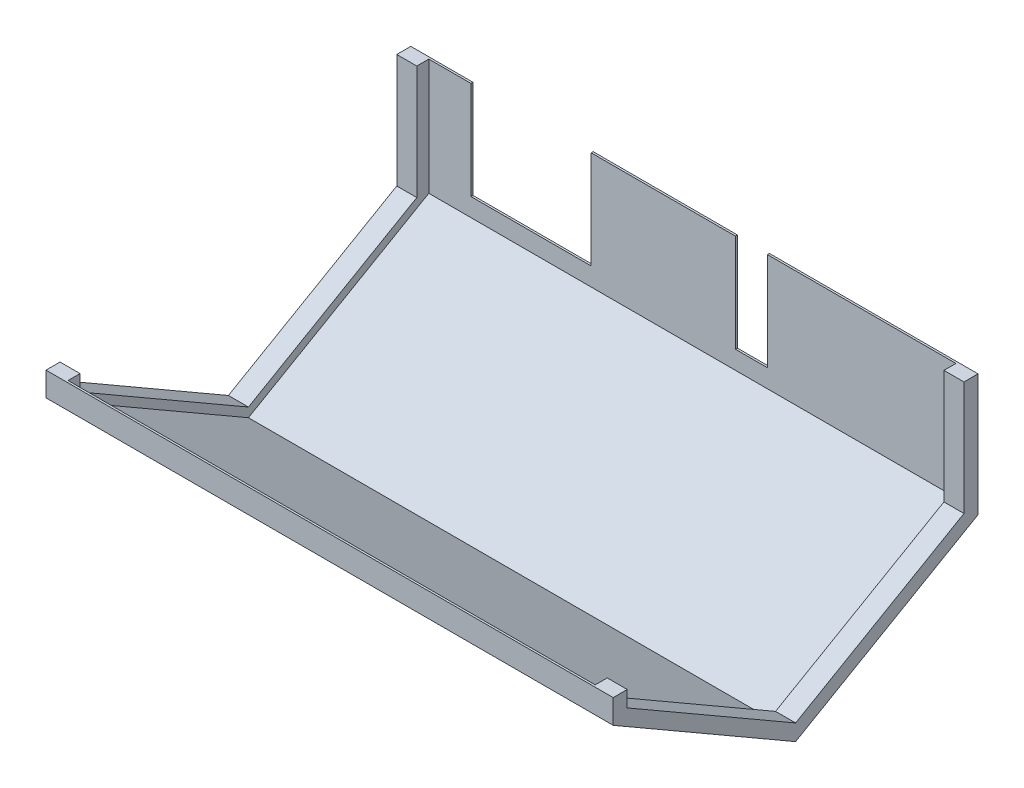
ISO-10303-21;
HEADER;
FILE_DESCRIPTION(('STEP AP214'),'2;1');
FILE_NAME('part.step','',(''),(''),'','','');
FILE_SCHEMA(('AUTOMOTIVE_DESIGN { 1 0 10303 214 1 1 1 1 }'));
ENDSEC;
DATA;
#1=APPLICATION_CONTEXT('core data for automotive mechanical design processes');
#2=APPLICATION_PROTOCOL_DEFINITION('international standard','automotive_design',2000,#1);
#3=PRODUCT_CONTEXT('',#1,'mechanical');
#4=PRODUCT('Part','Part','',(#3));
#5=PRODUCT_RELATED_PRODUCT_CATEGORY('part','',(#4));
#6=PRODUCT_DEFINITION_FORMATION('','',#4);
#7=PRODUCT_DEFINITION_CONTEXT('part definition',#1,'design');
#8=PRODUCT_DEFINITION('design','',#6,#7);
#9=PRODUCT_DEFINITION_SHAPE('','',#8);
#10=(LENGTH_UNIT() NAMED_UNIT(*) SI_UNIT(.MILLI.,.METRE.));
#11=(NAMED_UNIT(*) PLANE_ANGLE_UNIT() SI_UNIT($,.RADIAN.));
#12=(NAMED_UNIT(*) SI_UNIT($,.STERADIAN.) SOLID_ANGLE_UNIT());
#13=UNCERTAINTY_MEASURE_WITH_UNIT(LENGTH_MEASURE(1.E-05),#10,'distance_accuracy_value','');
#14=(GEOMETRIC_REPRESENTATION_CONTEXT(3) GLOBAL_UNCERTAINTY_ASSIGNED_CONTEXT((#13)) GLOBAL_UNIT_ASSIGNED_CONTEXT((#10,
#11,#12)) REPRESENTATION_CONTEXT('',''));
#15=CARTESIAN_POINT('',(0.,0.,0.));
#16=DIRECTION('',(0.,0.,1.));
#17=DIRECTION('',(1.,0.,0.));
#18=AXIS2_PLACEMENT_3D('',#15,#16,#17);
#19=CARTESIAN_POINT('',(-23872.5664602388,2750.,-9050.));
#20=DIRECTION('',(0.,1.,0.));
#21=DIRECTION('',(0.,0.,1.));
#22=AXIS2_PLACEMENT_3D('',#19,#20,#21);
#23=PLANE('',#22);
#24=DIRECTION('',(0.,0.,1.));
#25=VECTOR('',#24,1.);
#26=CARTESIAN_POINT('',(-5500.,2750.,-9050.));
#27=LINE('',#26,#25);
#28=CARTESIAN_POINT('',(-5500.,2750.,-9050.));
#29=VERTEX_POINT('',#28);
#30=CARTESIAN_POINT('',(-5500.,2750.,-9000.));
#31=VERTEX_POINT('',#30);
#32=EDGE_CURVE('E432',#29,#31,#27,.T.);
#33=ORIENTED_EDGE('',*,*,#32,.F.);
#34=DIRECTION('',(1.,0.,0.));
#35=VECTOR('',#34,1.);
#36=CARTESIAN_POINT('',(-23872.5664602388,2750.,-9050.));
#37=LINE('',#36,#35);
#38=CARTESIAN_POINT('',(-9100.,2750.,-9050.));
#39=VERTEX_POINT('',#38);
#40=EDGE_CURVE('E378',#39,#29,#37,.T.);
#41=ORIENTED_EDGE('',*,*,#40,.F.);
#42=DIRECTION('',(0.,0.,-1.));
#43=VECTOR('',#42,1.);
#44=CARTESIAN_POINT('',(-9100.,2750.,-9050.));
#45=LINE('',#44,#43);
#46=CARTESIAN_POINT('',(-9100.,2750.,-9000.));
#47=VERTEX_POINT('',#46);
#48=EDGE_CURVE('E424',#47,#39,#45,.T.);
#49=ORIENTED_EDGE('',*,*,#48,.F.);
#50=DIRECTION('',(1.,0.,0.));
#51=VECTOR('',#50,1.);
#52=CARTESIAN_POINT('',(-23872.5664602388,2750.,-9000.));
#53=LINE('',#52,#51);
#54=EDGE_CURVE('E373',#47,#31,#53,.T.);
#55=ORIENTED_EDGE('',*,*,#54,.T.);
#56=EDGE_LOOP('',(#33,#41,#49,#55));
#57=FACE_BOUND('',#56,.T.);
#58=ADVANCED_FACE('F41',(#57),#23,.T.);
#59=DIRECTION('',(0.,0.,-1.));
#60=VECTOR('',#59,1.);
#61=CARTESIAN_POINT('',(-4700.,2750.,-9050.));
#62=LINE('',#61,#60);
#63=CARTESIAN_POINT('',(-4700.,2750.,-9000.));
#64=VERTEX_POINT('',#63);
#65=CARTESIAN_POINT('',(-4700.,2750.,-9050.));
#66=VERTEX_POINT('',#65);
#67=EDGE_CURVE('E392',#64,#66,#62,.T.);
#68=ORIENTED_EDGE('',*,*,#67,.F.);
#69=CARTESIAN_POINT('',(0.,2750.,-9000.));
#70=VERTEX_POINT('',#69);
#71=EDGE_CURVE('E374',#64,#70,#53,.T.);
#72=ORIENTED_EDGE('',*,*,#71,.T.);
#73=DIRECTION('',(0.,0.,1.));
#74=VECTOR('',#73,1.);
#75=CARTESIAN_POINT('',(0.,2750.,-9050.));
#76=LINE('',#75,#74);
#77=CARTESIAN_POINT('',(0.,2750.,-8700.));
#78=VERTEX_POINT('',#77);
#79=EDGE_CURVE('E287',#70,#78,#76,.T.);
#80=ORIENTED_EDGE('',*,*,#79,.T.);
#81=DIRECTION('',(-1.,0.,0.));
#82=VECTOR('',#81,1.);
#83=CARTESIAN_POINT('',(500.,2750.,-8700.));
#84=LINE('',#83,#82);
#85=CARTESIAN_POINT('',(500.,2750.,-8700.));
#86=VERTEX_POINT('',#85);
#87=EDGE_CURVE('E334',#86,#78,#84,.T.);
#88=ORIENTED_EDGE('',*,*,#87,.F.);
#89=DIRECTION('',(0.,0.,1.));
#90=VECTOR('',#89,1.);
#91=CARTESIAN_POINT('',(500.,2750.,-9050.));
#92=LINE('',#91,#90);
#93=CARTESIAN_POINT('',(500.,2750.,-9050.));
#94=VERTEX_POINT('',#93);
#95=EDGE_CURVE('E301',#94,#86,#92,.T.);
#96=ORIENTED_EDGE('',*,*,#95,.F.);
#97=EDGE_CURVE('E379',#66,#94,#37,.T.);
#98=ORIENTED_EDGE('',*,*,#97,.F.);
#99=EDGE_LOOP('',(#68,#72,#80,#88,#96,#98));
#100=FACE_BOUND('',#99,.T.);
#101=ADVANCED_FACE('F446',(#100),#23,.T.);
#102=CARTESIAN_POINT('',(-23872.5664602388,-2921.28129211017,-4500.));
#103=DIRECTION('',(0.,-0.866025403784442,0.499999999999995));
#104=DIRECTION('',(0.,-0.499999999999995,-0.866025403784442));
#105=AXIS2_PLACEMENT_3D('',#102,#103,#104);
#106=PLANE('',#105);
#107=DIRECTION('',(1.,0.,0.));
#108=VECTOR('',#107,1.);
#109=CARTESIAN_POINT('',(-23872.5664602388,-294.337567297406,50.0000000000025));
#110=LINE('',#109,#108);
#111=CARTESIAN_POINT('',(-13650.,-294.337567297405,50.0000000000025));
#112=VERTEX_POINT('',#111);
#113=CARTESIAN_POINT('',(500.,-294.337567297406,50.0000000000025));
#114=VERTEX_POINT('',#113);
#115=EDGE_CURVE('E342',#112,#114,#110,.T.);
#116=ORIENTED_EDGE('',*,*,#115,.F.);
#117=DIRECTION('',(0.,-0.499999999999995,-0.866025403784442));
#118=VECTOR('',#117,1.);
#119=CARTESIAN_POINT('',(-13650.,-3452.01812759763,-5419.26316451262));
#120=LINE('',#119,#118);
#121=CARTESIAN_POINT('',(-13650.,-2921.28129211017,-4500.));
#122=VERTEX_POINT('',#121);
#123=EDGE_CURVE('E243',#112,#122,#120,.T.);
#124=ORIENTED_EDGE('',*,*,#123,.T.);
#125=DIRECTION('',(1.,0.,0.));
#126=VECTOR('',#125,1.);
#127=CARTESIAN_POINT('',(-23872.5664602388,-2921.28129211017,-4500.));
#128=LINE('',#127,#126);
#129=CARTESIAN_POINT('',(500.,-2921.28129211017,-4500.));
#130=VERTEX_POINT('',#129);
#131=EDGE_CURVE('E362',#122,#130,#128,.T.);
#132=ORIENTED_EDGE('',*,*,#131,.T.);
#133=DIRECTION('',(0.,-0.499999999999995,-0.866025403784442));
#134=VECTOR('',#133,1.);
#135=CARTESIAN_POINT('',(500.,-294.337567297406,50.0000000000025));
#136=LINE('',#135,#134);
#137=EDGE_CURVE('E313',#114,#130,#136,.T.);
#138=ORIENTED_EDGE('',*,*,#137,.F.);
#139=EDGE_LOOP('',(#116,#124,#132,#138));
#140=FACE_BOUND('',#139,.T.);
#141=ADVANCED_FACE('F43',(#140),#106,.T.);
#142=CARTESIAN_POINT('',(-23872.5664602388,-294.337567297406,50.0000000000025));
#143=DIRECTION('',(0.,0.,1.));
#144=DIRECTION('',(1.,0.,0.));
#145=AXIS2_PLACEMENT_3D('',#142,#143,#144);
#146=PLANE('',#145);
#147=DIRECTION('',(1.,0.,0.));
#148=VECTOR('',#147,1.);
#149=CARTESIAN_POINT('',(-14440.1640773263,305.662432702595,50.0000000000025));
#150=LINE('',#149,#148);
#151=CARTESIAN_POINT('',(-13650.,305.662432702595,50.0000000000025));
#152=VERTEX_POINT('',#151);
#153=CARTESIAN_POINT('',(499.999999999996,305.662432702595,50.0000000000025));
#154=VERTEX_POINT('',#153);
#155=EDGE_CURVE('E225',#152,#154,#150,.T.);
#156=ORIENTED_EDGE('',*,*,#155,.F.);
#157=DIRECTION('',(0.,-1.,0.));
#158=VECTOR('',#157,1.);
#159=CARTESIAN_POINT('',(-13650.,2750.,50.0000000000025));
#160=LINE('',#159,#158);
#161=EDGE_CURVE('E235',#152,#112,#160,.T.);
#162=ORIENTED_EDGE('',*,*,#161,.T.);
#163=ORIENTED_EDGE('',*,*,#115,.T.);
#164=DIRECTION('',(0.,-1.,0.));
#165=VECTOR('',#164,1.);
#166=CARTESIAN_POINT('',(500.,2750.,50.0000000000025));
#167=LINE('',#166,#165);
#168=EDGE_CURVE('E237',#154,#114,#167,.T.);
#169=ORIENTED_EDGE('',*,*,#168,.F.);
#170=EDGE_LOOP('',(#156,#162,#163,#169));
#171=FACE_BOUND('',#170,.T.);
#172=ADVANCED_FACE('F233',(#171),#146,.T.);
#173=CARTESIAN_POINT('',(-23872.5664602388,2750.,1.77635683940025E-12));
#174=DIRECTION('',(0.,0.,-1.));
#175=DIRECTION('',(-1.,0.,0.));
#176=AXIS2_PLACEMENT_3D('',#173,#174,#175);
#177=PLANE('',#176);
#178=DIRECTION('',(-1.,0.,0.));
#179=VECTOR('',#178,1.);
#180=CARTESIAN_POINT('',(-23872.5664602388,305.662432702595,1.77635683940025E-12));
#181=LINE('',#180,#179);
#182=CARTESIAN_POINT('',(0.,305.662432702595,1.77635683940025E-12));
#183=VERTEX_POINT('',#182);
#184=CARTESIAN_POINT('',(-13150.,305.662432702595,1.77635684101785E-12));
#185=VERTEX_POINT('',#184);
#186=EDGE_CURVE('E507',#183,#185,#181,.T.);
#187=ORIENTED_EDGE('',*,*,#186,.F.);
#188=DIRECTION('',(0.,1.,0.));
#189=VECTOR('',#188,1.);
#190=CARTESIAN_POINT('',(0.,2750.,1.77635683940025E-12));
#191=LINE('',#190,#189);
#192=CARTESIAN_POINT('',(0.,-150.,1.77635683940025E-12));
#193=VERTEX_POINT('',#192);
#194=EDGE_CURVE('E359',#193,#183,#191,.T.);
#195=ORIENTED_EDGE('',*,*,#194,.F.);
#196=DIRECTION('',(1.,0.,0.));
#197=VECTOR('',#196,1.);
#198=CARTESIAN_POINT('',(-23872.5664602388,-150.,1.77635683940025E-12));
#199=LINE('',#198,#197);
#200=CARTESIAN_POINT('',(-13150.,-150.,1.77635683504327E-12));
#201=VERTEX_POINT('',#200);
#202=EDGE_CURVE('E364',#201,#193,#199,.T.);
#203=ORIENTED_EDGE('',*,*,#202,.F.);
#204=DIRECTION('',(0.,-1.,0.));
#205=VECTOR('',#204,1.);
#206=CARTESIAN_POINT('',(-13150.,2750.,1.77635683940025E-12));
#207=LINE('',#206,#205);
#208=EDGE_CURVE('E348',#185,#201,#207,.T.);
#209=ORIENTED_EDGE('',*,*,#208,.F.);
#210=EDGE_LOOP('',(#187,#195,#203,#209));
#211=FACE_BOUND('',#210,.T.);
#212=ADVANCED_FACE('F518',(#211),#177,.T.);
#213=CARTESIAN_POINT('',(-23872.5664602388,-150.,1.77635683940025E-12));
#214=DIRECTION('',(0.,0.866025403784442,-0.499999999999995));
#215=DIRECTION('',(0.,0.499999999999995,0.866025403784442));
#216=AXIS2_PLACEMENT_3D('',#213,#214,#215);
#217=PLANE('',#216);
#218=DIRECTION('',(0.,-0.499999999999995,-0.866025403784442));
#219=VECTOR('',#218,1.);
#220=CARTESIAN_POINT('',(-13150.,-149.999999999998,4.95087421732843E-12));
#221=LINE('',#220,#219);
#222=CARTESIAN_POINT('',(-13150.,-2748.07621135328,-4500.));
#223=VERTEX_POINT('',#222);
#224=EDGE_CURVE('E345',#201,#223,#221,.T.);
#225=ORIENTED_EDGE('',*,*,#224,.F.);
#226=ORIENTED_EDGE('',*,*,#202,.T.);
#227=DIRECTION('',(0.,0.499999999999995,0.866025403784442));
#228=VECTOR('',#227,1.);
#229=CARTESIAN_POINT('',(0.,-150.,1.77635683940025E-12));
#230=LINE('',#229,#228);
#231=CARTESIAN_POINT('',(0.,-2748.07621135328,-4500.));
#232=VERTEX_POINT('',#231);
#233=EDGE_CURVE('E356',#232,#193,#230,.T.);
#234=ORIENTED_EDGE('',*,*,#233,.F.);
#235=DIRECTION('',(1.,0.,0.));
#236=VECTOR('',#235,1.);
#237=CARTESIAN_POINT('',(-23872.5664602388,-2748.07621135328,-4500.));
#238=LINE('',#237,#236);
#239=EDGE_CURVE('E366',#223,#232,#238,.T.);
#240=ORIENTED_EDGE('',*,*,#239,.F.);
#241=EDGE_LOOP('',(#225,#226,#234,#240));
#242=FACE_BOUND('',#241,.T.);
#243=ADVANCED_FACE('F521',(#242),#217,.T.);
#244=CARTESIAN_POINT('',(-23872.5664602388,-150.,-9000.));
#245=DIRECTION('',(0.,0.866025403784441,0.499999999999995));
#246=DIRECTION('',(0.,-0.499999999999995,0.866025403784442));
#247=AXIS2_PLACEMENT_3D('',#244,#245,#246);
#248=PLANE('',#247);
#249=DIRECTION('',(0.,0.499999999999995,-0.866025403784442));
#250=VECTOR('',#249,1.);
#251=CARTESIAN_POINT('',(-13150.,-150.000000000002,-8999.99999999999));
#252=LINE('',#251,#250);
#253=CARTESIAN_POINT('',(-13150.,-150.,-9000.));
#254=VERTEX_POINT('',#253);
#255=EDGE_CURVE('E341',#223,#254,#252,.T.);
#256=ORIENTED_EDGE('',*,*,#255,.F.);
#257=ORIENTED_EDGE('',*,*,#239,.T.);
#258=DIRECTION('',(0.,-0.499999999999995,0.866025403784441));
#259=VECTOR('',#258,1.);
#260=CARTESIAN_POINT('',(0.,-150.,-9000.));
#261=LINE('',#260,#259);
#262=CARTESIAN_POINT('',(0.,-150.,-9000.));
#263=VERTEX_POINT('',#262);
#264=EDGE_CURVE('E353',#263,#232,#261,.T.);
#265=ORIENTED_EDGE('',*,*,#264,.F.);
#266=DIRECTION('',(1.,0.,0.));
#267=VECTOR('',#266,1.);
#268=CARTESIAN_POINT('',(-23872.5664602388,-150.,-9000.));
#269=LINE('',#268,#267);
#270=EDGE_CURVE('E368',#254,#263,#269,.T.);
#271=ORIENTED_EDGE('',*,*,#270,.F.);
#272=EDGE_LOOP('',(#256,#257,#265,#271));
#273=FACE_BOUND('',#272,.T.);
#274=ADVANCED_FACE('F475',(#273),#248,.T.);
#275=CARTESIAN_POINT('',(-23872.5664602388,2750.,-9000.));
#276=DIRECTION('',(0.,0.,1.));
#277=DIRECTION('',(1.,0.,0.));
#278=AXIS2_PLACEMENT_3D('',#275,#276,#277);
#279=PLANE('',#278);
#280=DIRECTION('',(0.,-1.,0.));
#281=VECTOR('',#280,1.);
#282=CARTESIAN_POINT('',(-5500.,2750.,-9000.));
#283=LINE('',#282,#281);
#284=CARTESIAN_POINT('',(-5500.,305.662432702594,-9000.));
#285=VERTEX_POINT('',#284);
#286=EDGE_CURVE('E252',#31,#285,#283,.T.);
#287=ORIENTED_EDGE('',*,*,#286,.F.);
#288=ORIENTED_EDGE('',*,*,#54,.F.);
#289=DIRECTION('',(0.,1.,0.));
#290=VECTOR('',#289,1.);
#291=CARTESIAN_POINT('',(-9100.,2750.,-9000.));
#292=LINE('',#291,#290);
#293=CARTESIAN_POINT('',(-9100.,305.662432702594,-9000.));
#294=VERTEX_POINT('',#293);
#295=EDGE_CURVE('E426',#294,#47,#292,.T.);
#296=ORIENTED_EDGE('',*,*,#295,.F.);
#297=DIRECTION('',(1.,0.,0.));
#298=VECTOR('',#297,1.);
#299=CARTESIAN_POINT('',(-23872.5664602388,305.662432702595,-9000.));
#300=LINE('',#299,#298);
#301=CARTESIAN_POINT('',(-12100.,305.662432702595,-9000.));
#302=VERTEX_POINT('',#301);
#303=EDGE_CURVE('E410',#302,#294,#300,.T.);
#304=ORIENTED_EDGE('',*,*,#303,.F.);
#305=DIRECTION('',(0.,-1.,0.));
#306=VECTOR('',#305,1.);
#307=CARTESIAN_POINT('',(-12100.,2750.,-9000.));
#308=LINE('',#307,#306);
#309=CARTESIAN_POINT('',(-12100.,2750.,-9000.));
#310=VERTEX_POINT('',#309);
#311=EDGE_CURVE('E422',#310,#302,#308,.T.);
#312=ORIENTED_EDGE('',*,*,#311,.F.);
#313=CARTESIAN_POINT('',(-13150.,2750.,-9000.));
#314=VERTEX_POINT('',#313);
#315=EDGE_CURVE('E370',#314,#310,#53,.T.);
#316=ORIENTED_EDGE('',*,*,#315,.F.);
#317=DIRECTION('',(0.,1.,0.));
#318=VECTOR('',#317,1.);
#319=CARTESIAN_POINT('',(-13150.,2750.,-9000.));
#320=LINE('',#319,#318);
#321=EDGE_CURVE('E338',#254,#314,#320,.T.);
#322=ORIENTED_EDGE('',*,*,#321,.F.);
#323=ORIENTED_EDGE('',*,*,#270,.T.);
#324=DIRECTION('',(0.,-1.,0.));
#325=VECTOR('',#324,1.);
#326=CARTESIAN_POINT('',(0.,2750.,-9000.));
#327=LINE('',#326,#325);
#328=EDGE_CURVE('E337',#70,#263,#327,.T.);
#329=ORIENTED_EDGE('',*,*,#328,.F.);
#330=ORIENTED_EDGE('',*,*,#71,.F.);
#331=DIRECTION('',(0.,1.,0.));
#332=VECTOR('',#331,1.);
#333=CARTESIAN_POINT('',(-4700.,2750.,-9000.));
#334=LINE('',#333,#332);
#335=CARTESIAN_POINT('',(-4700.,305.662432702594,-9000.));
#336=VERTEX_POINT('',#335);
#337=EDGE_CURVE('E429',#336,#64,#334,.T.);
#338=ORIENTED_EDGE('',*,*,#337,.F.);
#339=DIRECTION('',(1.,0.,0.));
#340=VECTOR('',#339,1.);
#341=CARTESIAN_POINT('',(-23872.5664602388,305.662432702597,-9000.));
#342=LINE('',#341,#340);
#343=EDGE_CURVE('E431',#285,#336,#342,.T.);
#344=ORIENTED_EDGE('',*,*,#343,.F.);
#345=EDGE_LOOP('',(#287,#288,#296,#304,#312,#316,#322,#323,#329,#330,#338,#344));
#346=FACE_BOUND('',#345,.T.);
#347=ADVANCED_FACE('F442',(#346),#279,.T.);
#348=DIRECTION('',(0.,0.,1.));
#349=VECTOR('',#348,1.);
#350=CARTESIAN_POINT('',(-12100.,2750.,-9050.));
#351=LINE('',#350,#349);
#352=CARTESIAN_POINT('',(-12100.,2750.,-9050.));
#353=VERTEX_POINT('',#352);
#354=EDGE_CURVE('E420',#353,#310,#351,.T.);
#355=ORIENTED_EDGE('',*,*,#354,.F.);
#356=CARTESIAN_POINT('',(-13650.,2750.,-9050.));
#357=VERTEX_POINT('',#356);
#358=EDGE_CURVE('E375',#357,#353,#37,.T.);
#359=ORIENTED_EDGE('',*,*,#358,.F.);
#360=DIRECTION('',(0.,0.,1.));
#361=VECTOR('',#360,1.);
#362=CARTESIAN_POINT('',(-13650.,2750.,-9000.));
#363=LINE('',#362,#361);
#364=CARTESIAN_POINT('',(-13650.,2750.,-8700.));
#365=VERTEX_POINT('',#364);
#366=EDGE_CURVE('E260',#357,#365,#363,.T.);
#367=ORIENTED_EDGE('',*,*,#366,.T.);
#368=DIRECTION('',(1.,0.,0.));
#369=VECTOR('',#368,1.);
#370=CARTESIAN_POINT('',(-13650.,2750.,-8700.));
#371=LINE('',#370,#369);
#372=CARTESIAN_POINT('',(-13150.,2750.,-8700.));
#373=VERTEX_POINT('',#372);
#374=EDGE_CURVE('E274',#365,#373,#371,.T.);
#375=ORIENTED_EDGE('',*,*,#374,.T.);
#376=DIRECTION('',(0.,0.,1.));
#377=VECTOR('',#376,1.);
#378=CARTESIAN_POINT('',(-13150.,2750.,-9000.));
#379=LINE('',#378,#377);
#380=EDGE_CURVE('E275',#314,#373,#379,.T.);
#381=ORIENTED_EDGE('',*,*,#380,.F.);
#382=ORIENTED_EDGE('',*,*,#315,.T.);
#383=EDGE_LOOP('',(#355,#359,#367,#375,#381,#382));
#384=FACE_BOUND('',#383,.T.);
#385=ADVANCED_FACE('F468',(#384),#23,.T.);
#386=CARTESIAN_POINT('',(-23872.5664602388,-294.337567297406,-9050.));
#387=DIRECTION('',(0.,0.,-1.));
#388=DIRECTION('',(-1.,0.,0.));
#389=AXIS2_PLACEMENT_3D('',#386,#387,#388);
#390=PLANE('',#389);
#391=DIRECTION('',(0.,1.,0.));
#392=VECTOR('',#391,1.);
#393=CARTESIAN_POINT('',(-5500.,305.662432702594,-9050.));
#394=LINE('',#393,#392);
#395=CARTESIAN_POINT('',(-5500.,305.662432702594,-9050.));
#396=VERTEX_POINT('',#395);
#397=EDGE_CURVE('E400',#396,#29,#394,.T.);
#398=ORIENTED_EDGE('',*,*,#397,.F.);
#399=DIRECTION('',(-1.,0.,0.));
#400=VECTOR('',#399,1.);
#401=CARTESIAN_POINT('',(-5500.,305.662432702594,-9050.));
#402=LINE('',#401,#400);
#403=CARTESIAN_POINT('',(-4700.,305.662432702594,-9050.));
#404=VERTEX_POINT('',#403);
#405=EDGE_CURVE('E397',#404,#396,#402,.T.);
#406=ORIENTED_EDGE('',*,*,#405,.F.);
#407=DIRECTION('',(0.,-1.,0.));
#408=VECTOR('',#407,1.);
#409=CARTESIAN_POINT('',(-4700.,-294.337567297406,-9050.));
#410=LINE('',#409,#408);
#411=EDGE_CURVE('E49',#66,#404,#410,.T.);
#412=ORIENTED_EDGE('',*,*,#411,.F.);
#413=ORIENTED_EDGE('',*,*,#97,.T.);
#414=DIRECTION('',(0.,1.,0.));
#415=VECTOR('',#414,1.);
#416=CARTESIAN_POINT('',(500.,2750.,-9050.));
#417=LINE('',#416,#415);
#418=CARTESIAN_POINT('',(500.,-294.337567297406,-9050.));
#419=VERTEX_POINT('',#418);
#420=EDGE_CURVE('E297',#419,#94,#417,.T.);
#421=ORIENTED_EDGE('',*,*,#420,.F.);
#422=DIRECTION('',(1.,0.,0.));
#423=VECTOR('',#422,1.);
#424=CARTESIAN_POINT('',(-23872.5664602388,-294.337567297406,-9050.));
#425=LINE('',#424,#423);
#426=CARTESIAN_POINT('',(-13650.,-294.337567297406,-9050.));
#427=VERTEX_POINT('',#426);
#428=EDGE_CURVE('E380',#427,#419,#425,.T.);
#429=ORIENTED_EDGE('',*,*,#428,.F.);
#430=DIRECTION('',(0.,1.,0.));
#431=VECTOR('',#430,1.);
#432=CARTESIAN_POINT('',(-13650.,2750.,-9050.));
#433=LINE('',#432,#431);
#434=EDGE_CURVE('E257',#427,#357,#433,.T.);
#435=ORIENTED_EDGE('',*,*,#434,.T.);
#436=ORIENTED_EDGE('',*,*,#358,.T.);
#437=DIRECTION('',(0.,1.,0.));
#438=VECTOR('',#437,1.);
#439=CARTESIAN_POINT('',(-12100.,2984.0804637106,-9050.));
#440=LINE('',#439,#438);
#441=CARTESIAN_POINT('',(-12100.,305.662432702595,-9050.));
#442=VERTEX_POINT('',#441);
#443=EDGE_CURVE('E413',#442,#353,#440,.T.);
#444=ORIENTED_EDGE('',*,*,#443,.F.);
#445=DIRECTION('',(-1.,0.,0.));
#446=VECTOR('',#445,1.);
#447=CARTESIAN_POINT('',(-9100.,305.662432702594,-9050.));
#448=LINE('',#447,#446);
#449=CARTESIAN_POINT('',(-9100.,305.662432702594,-9050.));
#450=VERTEX_POINT('',#449);
#451=EDGE_CURVE('E406',#450,#442,#448,.T.);
#452=ORIENTED_EDGE('',*,*,#451,.F.);
#453=DIRECTION('',(0.,-1.,0.));
#454=VECTOR('',#453,1.);
#455=CARTESIAN_POINT('',(-9100.,-294.337567297406,-9050.));
#456=LINE('',#455,#454);
#457=EDGE_CURVE('E350',#39,#450,#456,.T.);
#458=ORIENTED_EDGE('',*,*,#457,.F.);
#459=ORIENTED_EDGE('',*,*,#40,.T.);
#460=EDGE_LOOP('',(#398,#406,#412,#413,#421,#429,#435,#436,#444,#452,#458,#459));
#461=FACE_BOUND('',#460,.T.);
#462=ADVANCED_FACE('F398',(#461),#390,.T.);
#463=CARTESIAN_POINT('',(-23872.5664602388,-2921.28129211017,-4500.));
#464=DIRECTION('',(0.,-0.866025403784441,-0.499999999999995));
#465=DIRECTION('',(0.,0.499999999999995,-0.866025403784441));
#466=AXIS2_PLACEMENT_3D('',#463,#464,#465);
#467=PLANE('',#466);
#468=ORIENTED_EDGE('',*,*,#131,.F.);
#469=DIRECTION('',(0.,0.499999999999995,-0.866025403784442));
#470=VECTOR('',#469,1.);
#471=CARTESIAN_POINT('',(-13650.,445.09618943232,-10330.7368354874));
#472=LINE('',#471,#470);
#473=EDGE_CURVE('E246',#122,#427,#472,.T.);
#474=ORIENTED_EDGE('',*,*,#473,.T.);
#475=ORIENTED_EDGE('',*,*,#428,.T.);
#476=DIRECTION('',(0.,0.499999999999995,-0.866025403784442));
#477=VECTOR('',#476,1.);
#478=CARTESIAN_POINT('',(500.,-294.337567297406,-9050.));
#479=LINE('',#478,#477);
#480=EDGE_CURVE('E294',#130,#419,#479,.T.);
#481=ORIENTED_EDGE('',*,*,#480,.F.);
#482=EDGE_LOOP('',(#468,#474,#475,#481));
#483=FACE_BOUND('',#482,.T.);
#484=ADVANCED_FACE('F496',(#483),#467,.T.);
#485=CARTESIAN_POINT('',(0.,0.,0.));
#486=DIRECTION('',(1.,0.,0.));
#487=DIRECTION('',(0.,0.,-1.));
#488=AXIS2_PLACEMENT_3D('',#485,#486,#487);
#489=PLANE('',#488);
#490=ORIENTED_EDGE('',*,*,#194,.T.);
#491=DIRECTION('',(0.,0.,-1.));
#492=VECTOR('',#491,1.);
#493=CARTESIAN_POINT('',(0.,305.662432702595,0.));
#494=LINE('',#493,#492);
#495=CARTESIAN_POINT('',(0.,305.662432702595,-299.999999999998));
#496=VERTEX_POINT('',#495);
#497=EDGE_CURVE('E502',#183,#496,#494,.T.);
#498=ORIENTED_EDGE('',*,*,#497,.T.);
#499=DIRECTION('',(0.,1.,0.));
#500=VECTOR('',#499,1.);
#501=CARTESIAN_POINT('',(0.,2750.,-299.999999999997));
#502=LINE('',#501,#500);
#503=CARTESIAN_POINT('',(0.,-92.2649730810357,-299.999999999998));
#504=VERTEX_POINT('',#503);
#505=EDGE_CURVE('E298',#504,#496,#502,.T.);
#506=ORIENTED_EDGE('',*,*,#505,.F.);
#507=DIRECTION('',(0.,0.499999999999995,0.866025403784442));
#508=VECTOR('',#507,1.);
#509=CARTESIAN_POINT('',(0.,-92.2649730810357,-299.999999999998));
#510=LINE('',#509,#508);
#511=CARTESIAN_POINT('',(0.,-2517.13610367743,-4500.));
#512=VERTEX_POINT('',#511);
#513=EDGE_CURVE('E322',#512,#504,#510,.T.);
#514=ORIENTED_EDGE('',*,*,#513,.F.);
#515=DIRECTION('',(0.,-0.499999999999995,0.866025403784442));
#516=VECTOR('',#515,1.);
#517=CARTESIAN_POINT('',(0.,-92.264973081036,-8700.));
#518=LINE('',#517,#516);
#519=CARTESIAN_POINT('',(0.,-92.264973081036,-8700.));
#520=VERTEX_POINT('',#519);
#521=EDGE_CURVE('E320',#520,#512,#518,.T.);
#522=ORIENTED_EDGE('',*,*,#521,.F.);
#523=DIRECTION('',(0.,-1.,0.));
#524=VECTOR('',#523,1.);
#525=CARTESIAN_POINT('',(0.,2750.,-8700.));
#526=LINE('',#525,#524);
#527=EDGE_CURVE('E318',#78,#520,#526,.T.);
#528=ORIENTED_EDGE('',*,*,#527,.F.);
#529=ORIENTED_EDGE('',*,*,#79,.F.);
#530=ORIENTED_EDGE('',*,*,#328,.T.);
#531=ORIENTED_EDGE('',*,*,#264,.T.);
#532=ORIENTED_EDGE('',*,*,#233,.T.);
#533=EDGE_LOOP('',(#490,#498,#506,#514,#522,#528,#529,#530,#531,#532));
#534=FACE_BOUND('',#533,.T.);
#535=ADVANCED_FACE('F480',(#534),#489,.F.);
#536=CARTESIAN_POINT('',(500.,2750.,-8700.));
#537=DIRECTION('',(0.,0.,-1.));
#538=DIRECTION('',(0.,1.,0.));
#539=AXIS2_PLACEMENT_3D('',#536,#537,#538);
#540=PLANE('',#539);
#541=ORIENTED_EDGE('',*,*,#527,.T.);
#542=DIRECTION('',(-1.,0.,0.));
#543=VECTOR('',#542,1.);
#544=CARTESIAN_POINT('',(500.,-92.264973081036,-8700.));
#545=LINE('',#544,#543);
#546=CARTESIAN_POINT('',(500.,-92.264973081036,-8700.));
#547=VERTEX_POINT('',#546);
#548=EDGE_CURVE('E331',#547,#520,#545,.T.);
#549=ORIENTED_EDGE('',*,*,#548,.F.);
#550=DIRECTION('',(0.,-1.,0.));
#551=VECTOR('',#550,1.);
#552=CARTESIAN_POINT('',(500.,2750.,-8700.));
#553=LINE('',#552,#551);
#554=EDGE_CURVE('E303',#86,#547,#553,.T.);
#555=ORIENTED_EDGE('',*,*,#554,.F.);
#556=ORIENTED_EDGE('',*,*,#87,.T.);
#557=EDGE_LOOP('',(#541,#549,#555,#556));
#558=FACE_BOUND('',#557,.T.);
#559=ADVANCED_FACE('F485',(#558),#540,.F.);
#560=CARTESIAN_POINT('',(500.,-92.264973081036,-8700.));
#561=DIRECTION('',(0.,-0.866025403784442,-0.499999999999995));
#562=DIRECTION('',(0.,0.499999999999995,-0.866025403784442));
#563=AXIS2_PLACEMENT_3D('',#560,#561,#562);
#564=PLANE('',#563);
#565=ORIENTED_EDGE('',*,*,#521,.T.);
#566=DIRECTION('',(-1.,0.,0.));
#567=VECTOR('',#566,1.);
#568=CARTESIAN_POINT('',(500.,-2517.13610367743,-4500.));
#569=LINE('',#568,#567);
#570=CARTESIAN_POINT('',(500.,-2517.13610367743,-4500.));
#571=VERTEX_POINT('',#570);
#572=EDGE_CURVE('E328',#571,#512,#569,.T.);
#573=ORIENTED_EDGE('',*,*,#572,.F.);
#574=DIRECTION('',(0.,-0.499999999999995,0.866025403784442));
#575=VECTOR('',#574,1.);
#576=CARTESIAN_POINT('',(500.,-92.264973081036,-8700.));
#577=LINE('',#576,#575);
#578=EDGE_CURVE('E305',#547,#571,#577,.T.);
#579=ORIENTED_EDGE('',*,*,#578,.F.);
#580=ORIENTED_EDGE('',*,*,#548,.T.);
#581=EDGE_LOOP('',(#565,#573,#579,#580));
#582=FACE_BOUND('',#581,.T.);
#583=ADVANCED_FACE('F531',(#582),#564,.F.);
#584=CARTESIAN_POINT('',(500.,-92.2649730810357,-299.999999999998));
#585=DIRECTION('',(0.,-0.866025403784442,0.499999999999995));
#586=DIRECTION('',(0.,-0.499999999999995,-0.866025403784442));
#587=AXIS2_PLACEMENT_3D('',#584,#585,#586);
#588=PLANE('',#587);
#589=ORIENTED_EDGE('',*,*,#513,.T.);
#590=DIRECTION('',(-1.,0.,0.));
#591=VECTOR('',#590,1.);
#592=CARTESIAN_POINT('',(500.,-92.2649730810357,-299.999999999998));
#593=LINE('',#592,#591);
#594=CARTESIAN_POINT('',(500.,-92.2649730810357,-299.999999999998));
#595=VERTEX_POINT('',#594);
#596=EDGE_CURVE('E316',#595,#504,#593,.T.);
#597=ORIENTED_EDGE('',*,*,#596,.F.);
#598=DIRECTION('',(0.,0.499999999999995,0.866025403784442));
#599=VECTOR('',#598,1.);
#600=CARTESIAN_POINT('',(500.,-92.2649730810357,-299.999999999998));
#601=LINE('',#600,#599);
#602=EDGE_CURVE('E307',#571,#595,#601,.T.);
#603=ORIENTED_EDGE('',*,*,#602,.F.);
#604=ORIENTED_EDGE('',*,*,#572,.T.);
#605=EDGE_LOOP('',(#589,#597,#603,#604));
#606=FACE_BOUND('',#605,.T.);
#607=ADVANCED_FACE('F529',(#606),#588,.F.);
#608=CARTESIAN_POINT('',(500.,2750.,-299.999999999997));
#609=DIRECTION('',(0.,0.,1.));
#610=DIRECTION('',(0.,-1.,0.));
#611=AXIS2_PLACEMENT_3D('',#608,#609,#610);
#612=PLANE('',#611);
#613=ORIENTED_EDGE('',*,*,#505,.T.);
#614=DIRECTION('',(1.,0.,0.));
#615=VECTOR('',#614,1.);
#616=CARTESIAN_POINT('',(500.,305.662432702595,-299.999999999998));
#617=LINE('',#616,#615);
#618=CARTESIAN_POINT('',(500.,305.662432702595,-299.999999999998));
#619=VERTEX_POINT('',#618);
#620=EDGE_CURVE('E501',#496,#619,#617,.T.);
#621=ORIENTED_EDGE('',*,*,#620,.T.);
#622=DIRECTION('',(0.,1.,0.));
#623=VECTOR('',#622,1.);
#624=CARTESIAN_POINT('',(500.,2750.,-299.999999999997));
#625=LINE('',#624,#623);
#626=EDGE_CURVE('E309',#595,#619,#625,.T.);
#627=ORIENTED_EDGE('',*,*,#626,.F.);
#628=ORIENTED_EDGE('',*,*,#596,.T.);
#629=EDGE_LOOP('',(#613,#621,#627,#628));
#630=FACE_BOUND('',#629,.T.);
#631=ADVANCED_FACE('F525',(#630),#612,.F.);
#632=CARTESIAN_POINT('',(500.,0.,0.));
#633=DIRECTION('',(1.,0.,0.));
#634=DIRECTION('',(0.,0.,-1.));
#635=AXIS2_PLACEMENT_3D('',#632,#633,#634);
#636=PLANE('',#635);
#637=DIRECTION('',(0.,0.,-1.));
#638=VECTOR('',#637,1.);
#639=CARTESIAN_POINT('',(500.,305.662432702595,0.));
#640=LINE('',#639,#638);
#641=EDGE_CURVE('E416',#154,#619,#640,.T.);
#642=ORIENTED_EDGE('',*,*,#641,.F.);
#643=ORIENTED_EDGE('',*,*,#168,.T.);
#644=ORIENTED_EDGE('',*,*,#137,.T.);
#645=ORIENTED_EDGE('',*,*,#480,.T.);
#646=ORIENTED_EDGE('',*,*,#420,.T.);
#647=ORIENTED_EDGE('',*,*,#95,.T.);
#648=ORIENTED_EDGE('',*,*,#554,.T.);
#649=ORIENTED_EDGE('',*,*,#578,.T.);
#650=ORIENTED_EDGE('',*,*,#602,.T.);
#651=ORIENTED_EDGE('',*,*,#626,.T.);
#652=EDGE_LOOP('',(#642,#643,#644,#645,#646,#647,#648,#649,#650,#651));
#653=FACE_BOUND('',#652,.T.);
#654=ADVANCED_FACE('F489',(#653),#636,.T.);
#655=CARTESIAN_POINT('',(-13150.,0.,-5.19090943069184E-12));
#656=DIRECTION('',(-1.,0.,0.));
#657=DIRECTION('',(0.,0.,1.));
#658=AXIS2_PLACEMENT_3D('',#655,#656,#657);
#659=PLANE('',#658);
#660=DIRECTION('',(0.,1.,0.));
#661=VECTOR('',#660,1.);
#662=CARTESIAN_POINT('',(-13150.,2750.,-299.999999999997));
#663=LINE('',#662,#661);
#664=CARTESIAN_POINT('',(-13150.,-92.2649730810345,-299.999999999997));
#665=VERTEX_POINT('',#664);
#666=CARTESIAN_POINT('',(-13150.,305.662432702595,-299.999999999997));
#667=VERTEX_POINT('',#666);
#668=EDGE_CURVE('E244',#665,#667,#663,.T.);
#669=ORIENTED_EDGE('',*,*,#668,.T.);
#670=DIRECTION('',(0.,0.,1.));
#671=VECTOR('',#670,1.);
#672=CARTESIAN_POINT('',(-13150.,305.662432702595,-5.19090943069184E-12));
#673=LINE('',#672,#671);
#674=EDGE_CURVE('E509',#667,#185,#673,.T.);
#675=ORIENTED_EDGE('',*,*,#674,.T.);
#676=ORIENTED_EDGE('',*,*,#208,.T.);
#677=ORIENTED_EDGE('',*,*,#224,.T.);
#678=ORIENTED_EDGE('',*,*,#255,.T.);
#679=ORIENTED_EDGE('',*,*,#321,.T.);
#680=ORIENTED_EDGE('',*,*,#380,.T.);
#681=DIRECTION('',(0.,-1.,0.));
#682=VECTOR('',#681,1.);
#683=CARTESIAN_POINT('',(-13150.,2750.,-8700.));
#684=LINE('',#683,#682);
#685=CARTESIAN_POINT('',(-13150.,-92.2649730810361,-8700.));
#686=VERTEX_POINT('',#685);
#687=EDGE_CURVE('E277',#373,#686,#684,.T.);
#688=ORIENTED_EDGE('',*,*,#687,.T.);
#689=DIRECTION('',(0.,-0.499999999999995,0.866025403784442));
#690=VECTOR('',#689,1.);
#691=CARTESIAN_POINT('',(-13150.,748.205080756875,-10155.7368354874));
#692=LINE('',#691,#690);
#693=CARTESIAN_POINT('',(-13150.,-2517.13610367743,-4500.));
#694=VERTEX_POINT('',#693);
#695=EDGE_CURVE('E280',#686,#694,#692,.T.);
#696=ORIENTED_EDGE('',*,*,#695,.T.);
#697=DIRECTION('',(0.,0.499999999999995,0.866025403784442));
#698=VECTOR('',#697,1.);
#699=CARTESIAN_POINT('',(-13150.,-3148.90923627308,-5594.26316451262));
#700=LINE('',#699,#698);
#701=EDGE_CURVE('E249',#694,#665,#700,.T.);
#702=ORIENTED_EDGE('',*,*,#701,.T.);
#703=EDGE_LOOP('',(#669,#675,#676,#677,#678,#679,#680,#688,#696,#702));
#704=FACE_BOUND('',#703,.T.);
#705=ADVANCED_FACE('F471',(#704),#659,.F.);
#706=CARTESIAN_POINT('',(-13650.,2750.,-299.999999999997));
#707=DIRECTION('',(0.,0.,-1.));
#708=DIRECTION('',(0.,1.,0.));
#709=AXIS2_PLACEMENT_3D('',#706,#707,#708);
#710=PLANE('',#709);
#711=DIRECTION('',(-1.,0.,0.));
#712=VECTOR('',#711,1.);
#713=CARTESIAN_POINT('',(-13650.,305.662432702595,-299.999999999997));
#714=LINE('',#713,#712);
#715=CARTESIAN_POINT('',(-13650.,305.662432702595,-299.999999999997));
#716=VERTEX_POINT('',#715);
#717=EDGE_CURVE('E55',#667,#716,#714,.T.);
#718=ORIENTED_EDGE('',*,*,#717,.F.);
#719=ORIENTED_EDGE('',*,*,#668,.F.);
#720=DIRECTION('',(1.,0.,0.));
#721=VECTOR('',#720,1.);
#722=CARTESIAN_POINT('',(-13650.,-92.2649730810345,-299.999999999997));
#723=LINE('',#722,#721);
#724=CARTESIAN_POINT('',(-13650.,-92.2649730810345,-299.999999999997));
#725=VERTEX_POINT('',#724);
#726=EDGE_CURVE('E285',#725,#665,#723,.T.);
#727=ORIENTED_EDGE('',*,*,#726,.F.);
#728=DIRECTION('',(0.,1.,0.));
#729=VECTOR('',#728,1.);
#730=CARTESIAN_POINT('',(-13650.,2750.,-299.999999999997));
#731=LINE('',#730,#729);
#732=EDGE_CURVE('E272',#725,#716,#731,.T.);
#733=ORIENTED_EDGE('',*,*,#732,.T.);
#734=EDGE_LOOP('',(#718,#719,#727,#733));
#735=FACE_BOUND('',#734,.T.);
#736=ADVANCED_FACE('F600',(#735),#710,.T.);
#737=CARTESIAN_POINT('',(-13650.,-3148.90923627308,-5594.26316451262));
#738=DIRECTION('',(0.,0.866025403784442,-0.499999999999995));
#739=DIRECTION('',(0.,0.499999999999995,0.866025403784442));
#740=AXIS2_PLACEMENT_3D('',#737,#738,#739);
#741=PLANE('',#740);
#742=ORIENTED_EDGE('',*,*,#701,.F.);
#743=DIRECTION('',(1.,0.,0.));
#744=VECTOR('',#743,1.);
#745=CARTESIAN_POINT('',(-13650.,-2517.13610367743,-4500.));
#746=LINE('',#745,#744);
#747=CARTESIAN_POINT('',(-13650.,-2517.13610367743,-4500.));
#748=VERTEX_POINT('',#747);
#749=EDGE_CURVE('E288',#748,#694,#746,.T.);
#750=ORIENTED_EDGE('',*,*,#749,.F.);
#751=DIRECTION('',(0.,0.499999999999995,0.866025403784442));
#752=VECTOR('',#751,1.);
#753=CARTESIAN_POINT('',(-13650.,-3148.90923627308,-5594.26316451262));
#754=LINE('',#753,#752);
#755=EDGE_CURVE('E269',#748,#725,#754,.T.);
#756=ORIENTED_EDGE('',*,*,#755,.T.);
#757=ORIENTED_EDGE('',*,*,#726,.T.);
#758=EDGE_LOOP('',(#742,#750,#756,#757));
#759=FACE_BOUND('',#758,.T.);
#760=ADVANCED_FACE('F595',(#759),#741,.T.);
#761=CARTESIAN_POINT('',(-13650.,748.205080756875,-10155.7368354874));
#762=DIRECTION('',(0.,0.866025403784442,0.499999999999995));
#763=DIRECTION('',(0.,-0.499999999999995,0.866025403784442));
#764=AXIS2_PLACEMENT_3D('',#761,#762,#763);
#765=PLANE('',#764);
#766=ORIENTED_EDGE('',*,*,#695,.F.);
#767=DIRECTION('',(1.,0.,0.));
#768=VECTOR('',#767,1.);
#769=CARTESIAN_POINT('',(-13650.,-92.2649730810361,-8700.));
#770=LINE('',#769,#768);
#771=CARTESIAN_POINT('',(-13650.,-92.2649730810361,-8700.));
#772=VERTEX_POINT('',#771);
#773=EDGE_CURVE('E290',#772,#686,#770,.T.);
#774=ORIENTED_EDGE('',*,*,#773,.F.);
#775=DIRECTION('',(0.,-0.499999999999995,0.866025403784442));
#776=VECTOR('',#775,1.);
#777=CARTESIAN_POINT('',(-13650.,748.205080756875,-10155.7368354874));
#778=LINE('',#777,#776);
#779=EDGE_CURVE('E266',#772,#748,#778,.T.);
#780=ORIENTED_EDGE('',*,*,#779,.T.);
#781=ORIENTED_EDGE('',*,*,#749,.T.);
#782=EDGE_LOOP('',(#766,#774,#780,#781));
#783=FACE_BOUND('',#782,.T.);
#784=ADVANCED_FACE('F599',(#783),#765,.T.);
#785=CARTESIAN_POINT('',(-13650.,2750.,-8700.));
#786=DIRECTION('',(0.,0.,1.));
#787=DIRECTION('',(0.,-1.,0.));
#788=AXIS2_PLACEMENT_3D('',#785,#786,#787);
#789=PLANE('',#788);
#790=ORIENTED_EDGE('',*,*,#687,.F.);
#791=ORIENTED_EDGE('',*,*,#374,.F.);
#792=DIRECTION('',(0.,-1.,0.));
#793=VECTOR('',#792,1.);
#794=CARTESIAN_POINT('',(-13650.,2750.,-8700.));
#795=LINE('',#794,#793);
#796=EDGE_CURVE('E263',#365,#772,#795,.T.);
#797=ORIENTED_EDGE('',*,*,#796,.T.);
#798=ORIENTED_EDGE('',*,*,#773,.T.);
#799=EDGE_LOOP('',(#790,#791,#797,#798));
#800=FACE_BOUND('',#799,.T.);
#801=ADVANCED_FACE('F609',(#800),#789,.T.);
#802=CARTESIAN_POINT('',(-13650.,0.,-5.19090943069184E-12));
#803=DIRECTION('',(-1.,0.,0.));
#804=DIRECTION('',(0.,0.,1.));
#805=AXIS2_PLACEMENT_3D('',#802,#803,#804);
#806=PLANE('',#805);
#807=DIRECTION('',(0.,0.,1.));
#808=VECTOR('',#807,1.);
#809=CARTESIAN_POINT('',(-13650.,305.662432702595,-5.19090943069184E-12));
#810=LINE('',#809,#808);
#811=EDGE_CURVE('E11',#716,#152,#810,.T.);
#812=ORIENTED_EDGE('',*,*,#811,.F.);
#813=ORIENTED_EDGE('',*,*,#732,.F.);
#814=ORIENTED_EDGE('',*,*,#755,.F.);
#815=ORIENTED_EDGE('',*,*,#779,.F.);
#816=ORIENTED_EDGE('',*,*,#796,.F.);
#817=ORIENTED_EDGE('',*,*,#366,.F.);
#818=ORIENTED_EDGE('',*,*,#434,.F.);
#819=ORIENTED_EDGE('',*,*,#473,.F.);
#820=ORIENTED_EDGE('',*,*,#123,.F.);
#821=ORIENTED_EDGE('',*,*,#161,.F.);
#822=EDGE_LOOP('',(#812,#813,#814,#815,#816,#817,#818,#819,#820,#821));
#823=FACE_BOUND('',#822,.T.);
#824=ADVANCED_FACE('F240',(#823),#806,.T.);
#825=CARTESIAN_POINT('',(-9100.,2984.0804637106,-8590.));
#826=DIRECTION('',(1.,0.,0.));
#827=DIRECTION('',(0.,0.,-1.));
#828=AXIS2_PLACEMENT_3D('',#825,#826,#827);
#829=PLANE('',#828);
#830=ORIENTED_EDGE('',*,*,#295,.T.);
#831=ORIENTED_EDGE('',*,*,#48,.T.);
#832=ORIENTED_EDGE('',*,*,#457,.T.);
#833=DIRECTION('',(0.,0.,-1.));
#834=VECTOR('',#833,1.);
#835=CARTESIAN_POINT('',(-9100.,305.662432702594,-8590.));
#836=LINE('',#835,#834);
#837=EDGE_CURVE('E63',#294,#450,#836,.T.);
#838=ORIENTED_EDGE('',*,*,#837,.F.);
#839=EDGE_LOOP('',(#830,#831,#832,#838));
#840=FACE_BOUND('',#839,.T.);
#841=ADVANCED_FACE('F459',(#840),#829,.F.);
#842=CARTESIAN_POINT('',(-12100.,2984.0804637106,-8590.));
#843=DIRECTION('',(-1.,0.,0.));
#844=DIRECTION('',(0.,0.,1.));
#845=AXIS2_PLACEMENT_3D('',#842,#843,#844);
#846=PLANE('',#845);
#847=ORIENTED_EDGE('',*,*,#311,.T.);
#848=DIRECTION('',(0.,0.,-1.));
#849=VECTOR('',#848,1.);
#850=CARTESIAN_POINT('',(-12100.,305.662432702595,-8590.));
#851=LINE('',#850,#849);
#852=EDGE_CURVE('E414',#302,#442,#851,.T.);
#853=ORIENTED_EDGE('',*,*,#852,.T.);
#854=ORIENTED_EDGE('',*,*,#443,.T.);
#855=ORIENTED_EDGE('',*,*,#354,.T.);
#856=EDGE_LOOP('',(#847,#853,#854,#855));
#857=FACE_BOUND('',#856,.T.);
#858=ADVANCED_FACE('F464',(#857),#846,.F.);
#859=CARTESIAN_POINT('',(-9100.,305.662432702594,-8590.));
#860=DIRECTION('',(0.,-1.,0.));
#861=DIRECTION('',(1.,0.,0.));
#862=AXIS2_PLACEMENT_3D('',#859,#860,#861);
#863=PLANE('',#862);
#864=ORIENTED_EDGE('',*,*,#303,.T.);
#865=ORIENTED_EDGE('',*,*,#837,.T.);
#866=ORIENTED_EDGE('',*,*,#451,.T.);
#867=ORIENTED_EDGE('',*,*,#852,.F.);
#868=EDGE_LOOP('',(#864,#865,#866,#867));
#869=FACE_BOUND('',#868,.T.);
#870=ADVANCED_FACE('F462',(#869),#863,.F.);
#871=CARTESIAN_POINT('',(-5500.,305.662432702594,-8590.));
#872=DIRECTION('',(-1.,0.,0.));
#873=DIRECTION('',(0.,0.,1.));
#874=AXIS2_PLACEMENT_3D('',#871,#872,#873);
#875=PLANE('',#874);
#876=ORIENTED_EDGE('',*,*,#286,.T.);
#877=DIRECTION('',(0.,0.,-1.));
#878=VECTOR('',#877,1.);
#879=CARTESIAN_POINT('',(-5500.,305.662432702594,-8590.));
#880=LINE('',#879,#878);
#881=EDGE_CURVE('E404',#285,#396,#880,.T.);
#882=ORIENTED_EDGE('',*,*,#881,.T.);
#883=ORIENTED_EDGE('',*,*,#397,.T.);
#884=ORIENTED_EDGE('',*,*,#32,.T.);
#885=EDGE_LOOP('',(#876,#882,#883,#884));
#886=FACE_BOUND('',#885,.T.);
#887=ADVANCED_FACE('F436',(#886),#875,.F.);
#888=CARTESIAN_POINT('',(-5500.,305.662432702594,-8590.));
#889=DIRECTION('',(0.,-1.,0.));
#890=DIRECTION('',(1.,0.,0.));
#891=AXIS2_PLACEMENT_3D('',#888,#889,#890);
#892=PLANE('',#891);
#893=ORIENTED_EDGE('',*,*,#343,.T.);
#894=DIRECTION('',(0.,0.,-1.));
#895=VECTOR('',#894,1.);
#896=CARTESIAN_POINT('',(-4700.,305.662432702594,-8590.));
#897=LINE('',#896,#895);
#898=EDGE_CURVE('E389',#336,#404,#897,.T.);
#899=ORIENTED_EDGE('',*,*,#898,.T.);
#900=ORIENTED_EDGE('',*,*,#405,.T.);
#901=ORIENTED_EDGE('',*,*,#881,.F.);
#902=EDGE_LOOP('',(#893,#899,#900,#901));
#903=FACE_BOUND('',#902,.T.);
#904=ADVANCED_FACE('F441',(#903),#892,.F.);
#905=CARTESIAN_POINT('',(-4700.,305.662432702594,-8590.));
#906=DIRECTION('',(1.,0.,0.));
#907=DIRECTION('',(0.,0.,-1.));
#908=AXIS2_PLACEMENT_3D('',#905,#906,#907);
#909=PLANE('',#908);
#910=ORIENTED_EDGE('',*,*,#337,.T.);
#911=ORIENTED_EDGE('',*,*,#67,.T.);
#912=ORIENTED_EDGE('',*,*,#411,.T.);
#913=ORIENTED_EDGE('',*,*,#898,.F.);
#914=EDGE_LOOP('',(#910,#911,#912,#913));
#915=FACE_BOUND('',#914,.T.);
#916=ADVANCED_FACE('F388',(#915),#909,.F.);
#917=CARTESIAN_POINT('',(-14440.1640773263,305.662432702595,-619.999999999997));
#918=DIRECTION('',(0.,-1.,0.));
#919=DIRECTION('',(0.,0.,-1.));
#920=AXIS2_PLACEMENT_3D('',#917,#918,#919);
#921=PLANE('',#920);
#922=ORIENTED_EDGE('',*,*,#641,.T.);
#923=ORIENTED_EDGE('',*,*,#620,.F.);
#924=ORIENTED_EDGE('',*,*,#497,.F.);
#925=ORIENTED_EDGE('',*,*,#186,.T.);
#926=ORIENTED_EDGE('',*,*,#674,.F.);
#927=ORIENTED_EDGE('',*,*,#717,.T.);
#928=ORIENTED_EDGE('',*,*,#811,.T.);
#929=ORIENTED_EDGE('',*,*,#155,.T.);
#930=EDGE_LOOP('',(#922,#923,#924,#925,#926,#927,#928,#929));
#931=FACE_BOUND('',#930,.T.);
#932=ADVANCED_FACE('F224',(#931),#921,.F.);
#933=CLOSED_SHELL('',(#58,#101,#141,#172,#212,#243,#274,#347,#385,#462,#484,#535,#559,#583,#607,
#631,#654,#705,#736,#760,#784,#801,#824,#841,#858,#870,#887,#904,#916,#932));
#934=MANIFOLD_SOLID_BREP('B2',#933);
#935=ADVANCED_BREP_SHAPE_REPRESENTATION('',(#18,#934),#14);
#936=SHAPE_DEFINITION_REPRESENTATION(#9,#935);
ENDSEC;
END-ISO-10303-21;
